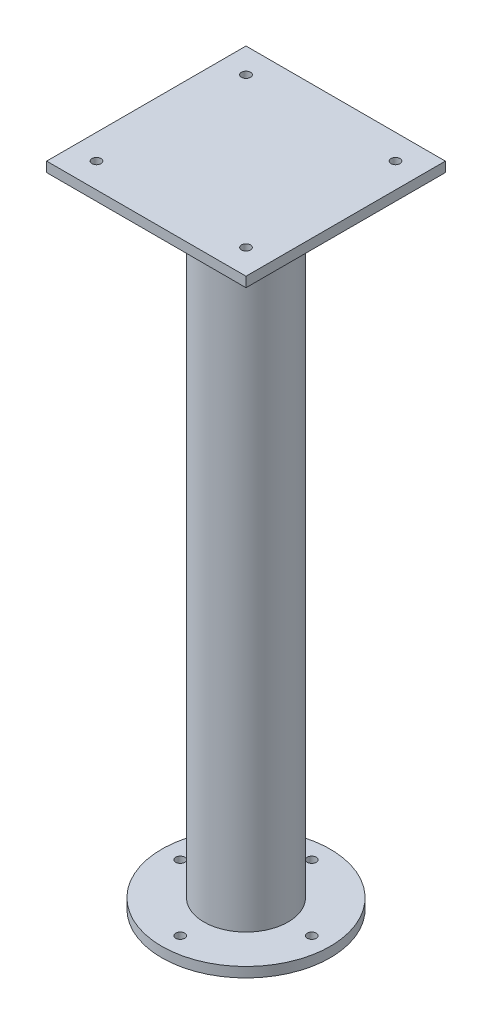
ISO-10303-21;
HEADER;
FILE_DESCRIPTION(('STEP AP214'),'2;1');
FILE_NAME('part.step','',(''),(''),'','','');
FILE_SCHEMA(('AUTOMOTIVE_DESIGN { 1 0 10303 214 1 1 1 1 }'));
ENDSEC;
DATA;
#1=APPLICATION_CONTEXT('core data for automotive mechanical design processes');
#2=APPLICATION_PROTOCOL_DEFINITION('international standard','automotive_design',2000,#1);
#3=PRODUCT_CONTEXT('',#1,'mechanical');
#4=PRODUCT('Part','Part','',(#3));
#5=PRODUCT_RELATED_PRODUCT_CATEGORY('part','',(#4));
#6=PRODUCT_DEFINITION_FORMATION('','',#4);
#7=PRODUCT_DEFINITION_CONTEXT('part definition',#1,'design');
#8=PRODUCT_DEFINITION('design','',#6,#7);
#9=PRODUCT_DEFINITION_SHAPE('','',#8);
#10=(LENGTH_UNIT() NAMED_UNIT(*) SI_UNIT(.MILLI.,.METRE.));
#11=(NAMED_UNIT(*) PLANE_ANGLE_UNIT() SI_UNIT($,.RADIAN.));
#12=(NAMED_UNIT(*) SI_UNIT($,.STERADIAN.) SOLID_ANGLE_UNIT());
#13=UNCERTAINTY_MEASURE_WITH_UNIT(LENGTH_MEASURE(1.E-05),#10,'distance_accuracy_value','');
#14=(GEOMETRIC_REPRESENTATION_CONTEXT(3) GLOBAL_UNCERTAINTY_ASSIGNED_CONTEXT((#13)) GLOBAL_UNIT_ASSIGNED_CONTEXT((#10,
#11,#12)) REPRESENTATION_CONTEXT('',''));
#15=CARTESIAN_POINT('',(0.,0.,0.));
#16=DIRECTION('',(0.,0.,1.));
#17=DIRECTION('',(1.,0.,0.));
#18=AXIS2_PLACEMENT_3D('',#15,#16,#17);
#19=CARTESIAN_POINT('',(0.,10.,0.));
#20=DIRECTION('',(0.,1.,0.));
#21=DIRECTION('',(0.,0.,1.));
#22=AXIS2_PLACEMENT_3D('',#19,#20,#21);
#23=PLANE('',#22);
#24=CARTESIAN_POINT('',(0.,10.,0.));
#25=DIRECTION('',(0.,1.,0.));
#26=DIRECTION('',(0.,0.,1.));
#27=AXIS2_PLACEMENT_3D('',#24,#25,#26);
#28=CIRCLE('',#27,42.25);
#29=CARTESIAN_POINT('',(0.,10.,42.25));
#30=VERTEX_POINT('',#29);
#31=EDGE_CURVE('E119',#30,#30,#28,.T.);
#32=ORIENTED_EDGE('',*,*,#31,.F.);
#33=EDGE_LOOP('',(#32));
#34=FACE_BOUND('',#33,.T.);
#35=CARTESIAN_POINT('',(-66.,10.,0.));
#36=DIRECTION('',(0.,1.,0.));
#37=DIRECTION('',(0.,0.,1.));
#38=AXIS2_PLACEMENT_3D('',#35,#36,#37);
#39=CIRCLE('',#38,4.5);
#40=CARTESIAN_POINT('',(-66.,10.,4.5));
#41=VERTEX_POINT('',#40);
#42=EDGE_CURVE('E132',#41,#41,#39,.T.);
#43=ORIENTED_EDGE('',*,*,#42,.F.);
#44=EDGE_LOOP('',(#43));
#45=FACE_BOUND('',#44,.T.);
#46=CARTESIAN_POINT('',(0.,10.,66.));
#47=DIRECTION('',(0.,1.,0.));
#48=DIRECTION('',(0.,0.,1.));
#49=AXIS2_PLACEMENT_3D('',#46,#47,#48);
#50=CIRCLE('',#49,4.5);
#51=CARTESIAN_POINT('',(0.,10.,70.5));
#52=VERTEX_POINT('',#51);
#53=EDGE_CURVE('E144',#52,#52,#50,.T.);
#54=ORIENTED_EDGE('',*,*,#53,.F.);
#55=EDGE_LOOP('',(#54));
#56=FACE_BOUND('',#55,.T.);
#57=CARTESIAN_POINT('',(0.,10.,0.));
#58=DIRECTION('',(0.,1.,0.));
#59=DIRECTION('',(0.,0.,1.));
#60=AXIS2_PLACEMENT_3D('',#57,#58,#59);
#61=CIRCLE('',#60,84.5);
#62=CARTESIAN_POINT('',(0.,10.,84.5));
#63=VERTEX_POINT('',#62);
#64=EDGE_CURVE('E11',#63,#63,#61,.T.);
#65=ORIENTED_EDGE('',*,*,#64,.T.);
#66=EDGE_LOOP('',(#65));
#67=FACE_BOUND('',#66,.T.);
#68=CARTESIAN_POINT('',(66.,10.,0.));
#69=DIRECTION('',(0.,1.,0.));
#70=DIRECTION('',(0.,0.,1.));
#71=AXIS2_PLACEMENT_3D('',#68,#69,#70);
#72=CIRCLE('',#71,4.5);
#73=CARTESIAN_POINT('',(66.,10.,4.5));
#74=VERTEX_POINT('',#73);
#75=EDGE_CURVE('E138',#74,#74,#72,.T.);
#76=ORIENTED_EDGE('',*,*,#75,.F.);
#77=EDGE_LOOP('',(#76));
#78=FACE_BOUND('',#77,.T.);
#79=CARTESIAN_POINT('',(0.,10.,-66.));
#80=DIRECTION('',(0.,1.,0.));
#81=DIRECTION('',(0.,0.,1.));
#82=AXIS2_PLACEMENT_3D('',#79,#80,#81);
#83=CIRCLE('',#82,4.5);
#84=CARTESIAN_POINT('',(0.,10.,-61.5));
#85=VERTEX_POINT('',#84);
#86=EDGE_CURVE('E126',#85,#85,#83,.T.);
#87=ORIENTED_EDGE('',*,*,#86,.F.);
#88=EDGE_LOOP('',(#87));
#89=FACE_BOUND('',#88,.T.);
#90=ADVANCED_FACE('F40',(#34,#45,#56,#67,#78,#89),#23,.T.);
#91=CARTESIAN_POINT('',(0.,0.,0.));
#92=DIRECTION('',(0.,1.,0.));
#93=DIRECTION('',(0.,0.,1.));
#94=AXIS2_PLACEMENT_3D('',#91,#92,#93);
#95=PLANE('',#94);
#96=CARTESIAN_POINT('',(0.,0.,0.));
#97=DIRECTION('',(0.,1.,0.));
#98=DIRECTION('',(0.,0.,1.));
#99=AXIS2_PLACEMENT_3D('',#96,#97,#98);
#100=CIRCLE('',#99,84.5);
#101=CARTESIAN_POINT('',(0.,0.,84.5));
#102=VERTEX_POINT('',#101);
#103=EDGE_CURVE('E50',#102,#102,#100,.T.);
#104=ORIENTED_EDGE('',*,*,#103,.F.);
#105=EDGE_LOOP('',(#104));
#106=FACE_BOUND('',#105,.T.);
#107=CARTESIAN_POINT('',(0.,0.,66.));
#108=DIRECTION('',(0.,1.,0.));
#109=DIRECTION('',(0.,0.,1.));
#110=AXIS2_PLACEMENT_3D('',#107,#108,#109);
#111=CIRCLE('',#110,4.5);
#112=CARTESIAN_POINT('',(0.,0.,70.5));
#113=VERTEX_POINT('',#112);
#114=EDGE_CURVE('E141',#113,#113,#111,.T.);
#115=ORIENTED_EDGE('',*,*,#114,.T.);
#116=EDGE_LOOP('',(#115));
#117=FACE_BOUND('',#116,.T.);
#118=CARTESIAN_POINT('',(66.,0.,0.));
#119=DIRECTION('',(0.,1.,0.));
#120=DIRECTION('',(0.,0.,1.));
#121=AXIS2_PLACEMENT_3D('',#118,#119,#120);
#122=CIRCLE('',#121,4.5);
#123=CARTESIAN_POINT('',(66.,0.,4.5));
#124=VERTEX_POINT('',#123);
#125=EDGE_CURVE('E135',#124,#124,#122,.T.);
#126=ORIENTED_EDGE('',*,*,#125,.T.);
#127=EDGE_LOOP('',(#126));
#128=FACE_BOUND('',#127,.T.);
#129=CARTESIAN_POINT('',(-66.,0.,0.));
#130=DIRECTION('',(0.,1.,0.));
#131=DIRECTION('',(0.,0.,1.));
#132=AXIS2_PLACEMENT_3D('',#129,#130,#131);
#133=CIRCLE('',#132,4.5);
#134=CARTESIAN_POINT('',(-66.,0.,4.5));
#135=VERTEX_POINT('',#134);
#136=EDGE_CURVE('E129',#135,#135,#133,.T.);
#137=ORIENTED_EDGE('',*,*,#136,.T.);
#138=EDGE_LOOP('',(#137));
#139=FACE_BOUND('',#138,.T.);
#140=CARTESIAN_POINT('',(0.,0.,-66.));
#141=DIRECTION('',(0.,1.,0.));
#142=DIRECTION('',(0.,0.,1.));
#143=AXIS2_PLACEMENT_3D('',#140,#141,#142);
#144=CIRCLE('',#143,4.5);
#145=CARTESIAN_POINT('',(0.,0.,-61.5));
#146=VERTEX_POINT('',#145);
#147=EDGE_CURVE('E123',#146,#146,#144,.T.);
#148=ORIENTED_EDGE('',*,*,#147,.T.);
#149=EDGE_LOOP('',(#148));
#150=FACE_BOUND('',#149,.T.);
#151=ADVANCED_FACE('F193',(#106,#117,#128,#139,#150),#95,.F.);
#152=CARTESIAN_POINT('',(0.,10.,0.));
#153=DIRECTION('',(0.,-1.,0.));
#154=DIRECTION('',(0.,0.,-1.));
#155=AXIS2_PLACEMENT_3D('',#152,#153,#154);
#156=CYLINDRICAL_SURFACE('',#155,84.5);
#157=ORIENTED_EDGE('',*,*,#64,.F.);
#158=EDGE_LOOP('',(#157));
#159=FACE_BOUND('',#158,.T.);
#160=ORIENTED_EDGE('',*,*,#103,.T.);
#161=EDGE_LOOP('',(#160));
#162=FACE_BOUND('',#161,.T.);
#163=ADVANCED_FACE('F42',(#159,#162),#156,.T.);
#164=CARTESIAN_POINT('',(0.,10.,66.));
#165=DIRECTION('',(0.,-1.,0.));
#166=DIRECTION('',(0.,0.,-1.));
#167=AXIS2_PLACEMENT_3D('',#164,#165,#166);
#168=CYLINDRICAL_SURFACE('',#167,4.5);
#169=ORIENTED_EDGE('',*,*,#53,.T.);
#170=EDGE_LOOP('',(#169));
#171=FACE_BOUND('',#170,.T.);
#172=ORIENTED_EDGE('',*,*,#114,.F.);
#173=EDGE_LOOP('',(#172));
#174=FACE_BOUND('',#173,.T.);
#175=ADVANCED_FACE('F203',(#171,#174),#168,.F.);
#176=CARTESIAN_POINT('',(66.,10.,0.));
#177=DIRECTION('',(0.,-1.,0.));
#178=DIRECTION('',(0.,0.,-1.));
#179=AXIS2_PLACEMENT_3D('',#176,#177,#178);
#180=CYLINDRICAL_SURFACE('',#179,4.5);
#181=ORIENTED_EDGE('',*,*,#75,.T.);
#182=EDGE_LOOP('',(#181));
#183=FACE_BOUND('',#182,.T.);
#184=ORIENTED_EDGE('',*,*,#125,.F.);
#185=EDGE_LOOP('',(#184));
#186=FACE_BOUND('',#185,.T.);
#187=ADVANCED_FACE('F206',(#183,#186),#180,.F.);
#188=CARTESIAN_POINT('',(-66.,10.,0.));
#189=DIRECTION('',(0.,-1.,0.));
#190=DIRECTION('',(0.,0.,-1.));
#191=AXIS2_PLACEMENT_3D('',#188,#189,#190);
#192=CYLINDRICAL_SURFACE('',#191,4.5);
#193=ORIENTED_EDGE('',*,*,#42,.T.);
#194=EDGE_LOOP('',(#193));
#195=FACE_BOUND('',#194,.T.);
#196=ORIENTED_EDGE('',*,*,#136,.F.);
#197=EDGE_LOOP('',(#196));
#198=FACE_BOUND('',#197,.T.);
#199=ADVANCED_FACE('F210',(#195,#198),#192,.F.);
#200=CARTESIAN_POINT('',(0.,10.,-66.));
#201=DIRECTION('',(0.,-1.,0.));
#202=DIRECTION('',(0.,0.,-1.));
#203=AXIS2_PLACEMENT_3D('',#200,#201,#202);
#204=CYLINDRICAL_SURFACE('',#203,4.5);
#205=ORIENTED_EDGE('',*,*,#86,.T.);
#206=EDGE_LOOP('',(#205));
#207=FACE_BOUND('',#206,.T.);
#208=ORIENTED_EDGE('',*,*,#147,.F.);
#209=EDGE_LOOP('',(#208));
#210=FACE_BOUND('',#209,.T.);
#211=ADVANCED_FACE('F214',(#207,#210),#204,.F.);
#212=CARTESIAN_POINT('',(0.,640.,0.));
#213=DIRECTION('',(0.,-1.,0.));
#214=DIRECTION('',(0.,0.,-1.));
#215=AXIS2_PLACEMENT_3D('',#212,#213,#214);
#216=CYLINDRICAL_SURFACE('',#215,42.25);
#217=CARTESIAN_POINT('',(0.,640.,0.));
#218=DIRECTION('',(0.,1.,0.));
#219=DIRECTION('',(0.,0.,1.));
#220=AXIS2_PLACEMENT_3D('',#217,#218,#219);
#221=CIRCLE('',#220,42.25);
#222=CARTESIAN_POINT('',(0.,640.,42.25));
#223=VERTEX_POINT('',#222);
#224=EDGE_CURVE('E120',#223,#223,#221,.T.);
#225=ORIENTED_EDGE('',*,*,#224,.F.);
#226=EDGE_LOOP('',(#225));
#227=FACE_BOUND('',#226,.T.);
#228=ORIENTED_EDGE('',*,*,#31,.T.);
#229=EDGE_LOOP('',(#228));
#230=FACE_BOUND('',#229,.T.);
#231=ADVANCED_FACE('F218',(#227,#230),#216,.T.);
#232=CARTESIAN_POINT('',(100.,650.,100.));
#233=DIRECTION('',(-1.,0.,0.));
#234=DIRECTION('',(0.,0.,1.));
#235=AXIS2_PLACEMENT_3D('',#232,#233,#234);
#236=PLANE('',#235);
#237=DIRECTION('',(0.,0.,-1.));
#238=VECTOR('',#237,1.);
#239=CARTESIAN_POINT('',(100.,640.,100.));
#240=LINE('',#239,#238);
#241=CARTESIAN_POINT('',(100.,640.,100.));
#242=VERTEX_POINT('',#241);
#243=CARTESIAN_POINT('',(100.,640.,-100.));
#244=VERTEX_POINT('',#243);
#245=EDGE_CURVE('E110',#242,#244,#240,.T.);
#246=ORIENTED_EDGE('',*,*,#245,.T.);
#247=DIRECTION('',(0.,-1.,0.));
#248=VECTOR('',#247,1.);
#249=CARTESIAN_POINT('',(100.,650.,-100.));
#250=LINE('',#249,#248);
#251=CARTESIAN_POINT('',(100.,650.,-100.));
#252=VERTEX_POINT('',#251);
#253=EDGE_CURVE('E101',#252,#244,#250,.T.);
#254=ORIENTED_EDGE('',*,*,#253,.F.);
#255=DIRECTION('',(0.,0.,-1.));
#256=VECTOR('',#255,1.);
#257=CARTESIAN_POINT('',(100.,650.,100.));
#258=LINE('',#257,#256);
#259=CARTESIAN_POINT('',(100.,650.,100.));
#260=VERTEX_POINT('',#259);
#261=EDGE_CURVE('E95',#260,#252,#258,.T.);
#262=ORIENTED_EDGE('',*,*,#261,.F.);
#263=DIRECTION('',(0.,-1.,0.));
#264=VECTOR('',#263,1.);
#265=CARTESIAN_POINT('',(100.,650.,100.));
#266=LINE('',#265,#264);
#267=EDGE_CURVE('E106',#260,#242,#266,.T.);
#268=ORIENTED_EDGE('',*,*,#267,.T.);
#269=EDGE_LOOP('',(#246,#254,#262,#268));
#270=FACE_BOUND('',#269,.T.);
#271=ADVANCED_FACE('F181',(#270),#236,.F.);
#272=CARTESIAN_POINT('',(-100.,650.,-100.));
#273=DIRECTION('',(0.,0.,1.));
#274=DIRECTION('',(1.,0.,0.));
#275=AXIS2_PLACEMENT_3D('',#272,#273,#274);
#276=PLANE('',#275);
#277=DIRECTION('',(-1.,0.,0.));
#278=VECTOR('',#277,1.);
#279=CARTESIAN_POINT('',(-100.,640.,-100.));
#280=LINE('',#279,#278);
#281=CARTESIAN_POINT('',(-100.,640.,-100.));
#282=VERTEX_POINT('',#281);
#283=EDGE_CURVE('E100',#244,#282,#280,.T.);
#284=ORIENTED_EDGE('',*,*,#283,.T.);
#285=DIRECTION('',(0.,-1.,0.));
#286=VECTOR('',#285,1.);
#287=CARTESIAN_POINT('',(-100.,650.,-100.));
#288=LINE('',#287,#286);
#289=CARTESIAN_POINT('',(-100.,650.,-100.));
#290=VERTEX_POINT('',#289);
#291=EDGE_CURVE('E98',#290,#282,#288,.T.);
#292=ORIENTED_EDGE('',*,*,#291,.F.);
#293=DIRECTION('',(-1.,0.,0.));
#294=VECTOR('',#293,1.);
#295=CARTESIAN_POINT('',(-100.,650.,-100.));
#296=LINE('',#295,#294);
#297=EDGE_CURVE('E90',#252,#290,#296,.T.);
#298=ORIENTED_EDGE('',*,*,#297,.F.);
#299=ORIENTED_EDGE('',*,*,#253,.T.);
#300=EDGE_LOOP('',(#284,#292,#298,#299));
#301=FACE_BOUND('',#300,.T.);
#302=ADVANCED_FACE('F99',(#301),#276,.F.);
#303=CARTESIAN_POINT('',(-100.,650.,100.));
#304=DIRECTION('',(1.,0.,0.));
#305=DIRECTION('',(0.,0.,-1.));
#306=AXIS2_PLACEMENT_3D('',#303,#304,#305);
#307=PLANE('',#306);
#308=DIRECTION('',(0.,0.,1.));
#309=VECTOR('',#308,1.);
#310=CARTESIAN_POINT('',(-100.,640.,100.));
#311=LINE('',#310,#309);
#312=CARTESIAN_POINT('',(-100.,640.,100.));
#313=VERTEX_POINT('',#312);
#314=EDGE_CURVE('E76',#282,#313,#311,.T.);
#315=ORIENTED_EDGE('',*,*,#314,.T.);
#316=DIRECTION('',(0.,-1.,0.));
#317=VECTOR('',#316,1.);
#318=CARTESIAN_POINT('',(-100.,650.,100.));
#319=LINE('',#318,#317);
#320=CARTESIAN_POINT('',(-100.,650.,100.));
#321=VERTEX_POINT('',#320);
#322=EDGE_CURVE('E102',#321,#313,#319,.T.);
#323=ORIENTED_EDGE('',*,*,#322,.F.);
#324=DIRECTION('',(0.,0.,1.));
#325=VECTOR('',#324,1.);
#326=CARTESIAN_POINT('',(-100.,650.,100.));
#327=LINE('',#326,#325);
#328=EDGE_CURVE('E93',#290,#321,#327,.T.);
#329=ORIENTED_EDGE('',*,*,#328,.F.);
#330=ORIENTED_EDGE('',*,*,#291,.T.);
#331=EDGE_LOOP('',(#315,#323,#329,#330));
#332=FACE_BOUND('',#331,.T.);
#333=ADVANCED_FACE('F104',(#332),#307,.F.);
#334=CARTESIAN_POINT('',(-100.,650.,100.));
#335=DIRECTION('',(0.,0.,-1.));
#336=DIRECTION('',(-1.,0.,0.));
#337=AXIS2_PLACEMENT_3D('',#334,#335,#336);
#338=PLANE('',#337);
#339=DIRECTION('',(1.,0.,0.));
#340=VECTOR('',#339,1.);
#341=CARTESIAN_POINT('',(-100.,640.,100.));
#342=LINE('',#341,#340);
#343=EDGE_CURVE('E82',#313,#242,#342,.T.);
#344=ORIENTED_EDGE('',*,*,#343,.T.);
#345=ORIENTED_EDGE('',*,*,#267,.F.);
#346=DIRECTION('',(1.,0.,0.));
#347=VECTOR('',#346,1.);
#348=CARTESIAN_POINT('',(-100.,650.,100.));
#349=LINE('',#348,#347);
#350=EDGE_CURVE('E59',#321,#260,#349,.T.);
#351=ORIENTED_EDGE('',*,*,#350,.F.);
#352=ORIENTED_EDGE('',*,*,#322,.T.);
#353=EDGE_LOOP('',(#344,#345,#351,#352));
#354=FACE_BOUND('',#353,.T.);
#355=ADVANCED_FACE('F182',(#354),#338,.F.);
#356=CARTESIAN_POINT('',(0.,650.,0.));
#357=DIRECTION('',(0.,-1.,0.));
#358=DIRECTION('',(0.,0.,-1.));
#359=AXIS2_PLACEMENT_3D('',#356,#357,#358);
#360=PLANE('',#359);
#361=CARTESIAN_POINT('',(75.,650.,75.));
#362=DIRECTION('',(0.,1.,0.));
#363=DIRECTION('',(0.,0.,1.));
#364=AXIS2_PLACEMENT_3D('',#361,#362,#363);
#365=CIRCLE('',#364,4.50000000000001);
#366=CARTESIAN_POINT('',(75.,650.,79.5));
#367=VERTEX_POINT('',#366);
#368=EDGE_CURVE('E406',#367,#367,#365,.T.);
#369=ORIENTED_EDGE('',*,*,#368,.F.);
#370=EDGE_LOOP('',(#369));
#371=FACE_BOUND('',#370,.T.);
#372=CARTESIAN_POINT('',(75.,650.,-75.));
#373=DIRECTION('',(0.,1.,0.));
#374=DIRECTION('',(0.,0.,1.));
#375=AXIS2_PLACEMENT_3D('',#372,#373,#374);
#376=CIRCLE('',#375,4.50000000000001);
#377=CARTESIAN_POINT('',(75.,650.,-70.5));
#378=VERTEX_POINT('',#377);
#379=EDGE_CURVE('E403',#378,#378,#376,.T.);
#380=ORIENTED_EDGE('',*,*,#379,.F.);
#381=EDGE_LOOP('',(#380));
#382=FACE_BOUND('',#381,.T.);
#383=CARTESIAN_POINT('',(-75.,650.,-75.));
#384=DIRECTION('',(0.,1.,0.));
#385=DIRECTION('',(0.,0.,1.));
#386=AXIS2_PLACEMENT_3D('',#383,#384,#385);
#387=CIRCLE('',#386,4.50000000000001);
#388=CARTESIAN_POINT('',(-75.,650.,-70.5));
#389=VERTEX_POINT('',#388);
#390=EDGE_CURVE('E405',#389,#389,#387,.T.);
#391=ORIENTED_EDGE('',*,*,#390,.F.);
#392=EDGE_LOOP('',(#391));
#393=FACE_BOUND('',#392,.T.);
#394=CARTESIAN_POINT('',(-75.,650.,75.));
#395=DIRECTION('',(0.,1.,0.));
#396=DIRECTION('',(0.,0.,1.));
#397=AXIS2_PLACEMENT_3D('',#394,#395,#396);
#398=CIRCLE('',#397,4.50000000000001);
#399=CARTESIAN_POINT('',(-75.,650.,79.5));
#400=VERTEX_POINT('',#399);
#401=EDGE_CURVE('E155',#400,#400,#398,.T.);
#402=ORIENTED_EDGE('',*,*,#401,.F.);
#403=EDGE_LOOP('',(#402));
#404=FACE_BOUND('',#403,.T.);
#405=ORIENTED_EDGE('',*,*,#261,.T.);
#406=ORIENTED_EDGE('',*,*,#297,.T.);
#407=ORIENTED_EDGE('',*,*,#328,.T.);
#408=ORIENTED_EDGE('',*,*,#350,.T.);
#409=EDGE_LOOP('',(#405,#406,#407,#408));
#410=FACE_BOUND('',#409,.T.);
#411=ADVANCED_FACE('F91',(#371,#382,#393,#404,#410),#360,.F.);
#412=CARTESIAN_POINT('',(0.,640.,0.));
#413=DIRECTION('',(0.,-1.,0.));
#414=DIRECTION('',(0.,0.,-1.));
#415=AXIS2_PLACEMENT_3D('',#412,#413,#414);
#416=PLANE('',#415);
#417=CARTESIAN_POINT('',(75.,640.,75.));
#418=DIRECTION('',(0.,-1.,0.));
#419=DIRECTION('',(0.,0.,-1.));
#420=AXIS2_PLACEMENT_3D('',#417,#418,#419);
#421=CIRCLE('',#420,4.50000000000001);
#422=CARTESIAN_POINT('',(75.,640.,70.5));
#423=VERTEX_POINT('',#422);
#424=EDGE_CURVE('E44',#423,#423,#421,.T.);
#425=ORIENTED_EDGE('',*,*,#424,.F.);
#426=EDGE_LOOP('',(#425));
#427=FACE_BOUND('',#426,.T.);
#428=CARTESIAN_POINT('',(75.,640.,-75.));
#429=DIRECTION('',(0.,-1.,0.));
#430=DIRECTION('',(0.,0.,-1.));
#431=AXIS2_PLACEMENT_3D('',#428,#429,#430);
#432=CIRCLE('',#431,4.50000000000001);
#433=CARTESIAN_POINT('',(75.,640.,-79.5));
#434=VERTEX_POINT('',#433);
#435=EDGE_CURVE('E157',#434,#434,#432,.T.);
#436=ORIENTED_EDGE('',*,*,#435,.F.);
#437=EDGE_LOOP('',(#436));
#438=FACE_BOUND('',#437,.T.);
#439=CARTESIAN_POINT('',(-75.,640.,-75.));
#440=DIRECTION('',(0.,-1.,0.));
#441=DIRECTION('',(0.,0.,-1.));
#442=AXIS2_PLACEMENT_3D('',#439,#440,#441);
#443=CIRCLE('',#442,4.50000000000001);
#444=CARTESIAN_POINT('',(-75.,640.,-79.5));
#445=VERTEX_POINT('',#444);
#446=EDGE_CURVE('E154',#445,#445,#443,.T.);
#447=ORIENTED_EDGE('',*,*,#446,.F.);
#448=EDGE_LOOP('',(#447));
#449=FACE_BOUND('',#448,.T.);
#450=CARTESIAN_POINT('',(-75.,640.,75.));
#451=DIRECTION('',(0.,-1.,0.));
#452=DIRECTION('',(0.,0.,-1.));
#453=AXIS2_PLACEMENT_3D('',#450,#451,#452);
#454=CIRCLE('',#453,4.50000000000001);
#455=CARTESIAN_POINT('',(-75.,640.,70.5));
#456=VERTEX_POINT('',#455);
#457=EDGE_CURVE('E151',#456,#456,#454,.T.);
#458=ORIENTED_EDGE('',*,*,#457,.F.);
#459=EDGE_LOOP('',(#458));
#460=FACE_BOUND('',#459,.T.);
#461=ORIENTED_EDGE('',*,*,#224,.T.);
#462=EDGE_LOOP('',(#461));
#463=FACE_BOUND('',#462,.T.);
#464=ORIENTED_EDGE('',*,*,#245,.F.);
#465=ORIENTED_EDGE('',*,*,#343,.F.);
#466=ORIENTED_EDGE('',*,*,#314,.F.);
#467=ORIENTED_EDGE('',*,*,#283,.F.);
#468=EDGE_LOOP('',(#464,#465,#466,#467));
#469=FACE_BOUND('',#468,.T.);
#470=ADVANCED_FACE('F167',(#427,#438,#449,#460,#463,#469),#416,.T.);
#471=CARTESIAN_POINT('',(-75.,0.,75.));
#472=DIRECTION('',(0.,1.,0.));
#473=DIRECTION('',(0.,0.,1.));
#474=AXIS2_PLACEMENT_3D('',#471,#472,#473);
#475=CYLINDRICAL_SURFACE('',#474,4.50000000000001);
#476=ORIENTED_EDGE('',*,*,#457,.T.);
#477=EDGE_LOOP('',(#476));
#478=FACE_BOUND('',#477,.T.);
#479=ORIENTED_EDGE('',*,*,#401,.T.);
#480=EDGE_LOOP('',(#479));
#481=FACE_BOUND('',#480,.T.);
#482=ADVANCED_FACE('F170',(#478,#481),#475,.F.);
#483=CARTESIAN_POINT('',(-75.,0.,-75.));
#484=DIRECTION('',(0.,1.,0.));
#485=DIRECTION('',(0.,0.,1.));
#486=AXIS2_PLACEMENT_3D('',#483,#484,#485);
#487=CYLINDRICAL_SURFACE('',#486,4.50000000000001);
#488=ORIENTED_EDGE('',*,*,#446,.T.);
#489=EDGE_LOOP('',(#488));
#490=FACE_BOUND('',#489,.T.);
#491=ORIENTED_EDGE('',*,*,#390,.T.);
#492=EDGE_LOOP('',(#491));
#493=FACE_BOUND('',#492,.T.);
#494=ADVANCED_FACE('F263',(#490,#493),#487,.F.);
#495=CARTESIAN_POINT('',(75.,0.,-75.));
#496=DIRECTION('',(0.,1.,0.));
#497=DIRECTION('',(0.,0.,1.));
#498=AXIS2_PLACEMENT_3D('',#495,#496,#497);
#499=CYLINDRICAL_SURFACE('',#498,4.50000000000001);
#500=ORIENTED_EDGE('',*,*,#435,.T.);
#501=EDGE_LOOP('',(#500));
#502=FACE_BOUND('',#501,.T.);
#503=ORIENTED_EDGE('',*,*,#379,.T.);
#504=EDGE_LOOP('',(#503));
#505=FACE_BOUND('',#504,.T.);
#506=ADVANCED_FACE('F274',(#502,#505),#499,.F.);
#507=CARTESIAN_POINT('',(75.,0.,75.));
#508=DIRECTION('',(0.,1.,0.));
#509=DIRECTION('',(0.,0.,1.));
#510=AXIS2_PLACEMENT_3D('',#507,#508,#509);
#511=CYLINDRICAL_SURFACE('',#510,4.50000000000001);
#512=ORIENTED_EDGE('',*,*,#424,.T.);
#513=EDGE_LOOP('',(#512));
#514=FACE_BOUND('',#513,.T.);
#515=ORIENTED_EDGE('',*,*,#368,.T.);
#516=EDGE_LOOP('',(#515));
#517=FACE_BOUND('',#516,.T.);
#518=ADVANCED_FACE('F164',(#514,#517),#511,.F.);
#519=CLOSED_SHELL('',(#90,#151,#163,#175,#187,#199,#211,#231,#271,#302,#333,#355,#411,#470,#482,
#494,#506,#518));
#520=MANIFOLD_SOLID_BREP('B2',#519);
#521=ADVANCED_BREP_SHAPE_REPRESENTATION('',(#18,#520),#14);
#522=SHAPE_DEFINITION_REPRESENTATION(#9,#521);
ENDSEC;
END-ISO-10303-21;
